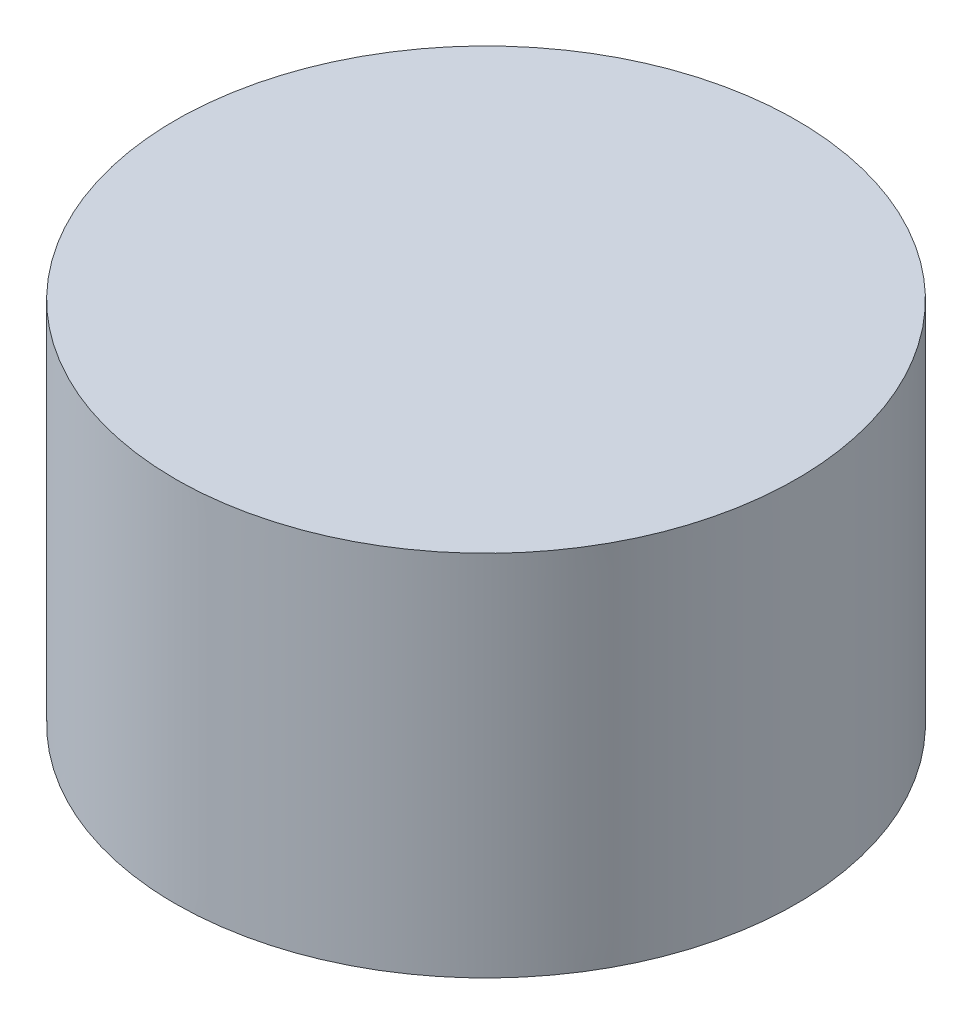
ISO-10303-21;
HEADER;
FILE_DESCRIPTION(('STEP AP214'),'2;1');
FILE_NAME('part.step','',(''),(''),'','','');
FILE_SCHEMA(('AUTOMOTIVE_DESIGN { 1 0 10303 214 1 1 1 1 }'));
ENDSEC;
DATA;
#1=APPLICATION_CONTEXT('core data for automotive mechanical design processes');
#2=APPLICATION_PROTOCOL_DEFINITION('international standard','automotive_design',2000,#1);
#3=PRODUCT_CONTEXT('',#1,'mechanical');
#4=PRODUCT('Part','Part','',(#3));
#5=PRODUCT_RELATED_PRODUCT_CATEGORY('part','',(#4));
#6=PRODUCT_DEFINITION_FORMATION('','',#4);
#7=PRODUCT_DEFINITION_CONTEXT('part definition',#1,'design');
#8=PRODUCT_DEFINITION('design','',#6,#7);
#9=PRODUCT_DEFINITION_SHAPE('','',#8);
#10=(LENGTH_UNIT() NAMED_UNIT(*) SI_UNIT(.MILLI.,.METRE.));
#11=(NAMED_UNIT(*) PLANE_ANGLE_UNIT() SI_UNIT($,.RADIAN.));
#12=(NAMED_UNIT(*) SI_UNIT($,.STERADIAN.) SOLID_ANGLE_UNIT());
#13=UNCERTAINTY_MEASURE_WITH_UNIT(LENGTH_MEASURE(1.E-05),#10,'distance_accuracy_value','');
#14=(GEOMETRIC_REPRESENTATION_CONTEXT(3) GLOBAL_UNCERTAINTY_ASSIGNED_CONTEXT((#13)) GLOBAL_UNIT_ASSIGNED_CONTEXT((#10,
#11,#12)) REPRESENTATION_CONTEXT('',''));
#15=CARTESIAN_POINT('',(0.,0.,0.));
#16=DIRECTION('',(0.,0.,1.));
#17=DIRECTION('',(1.,0.,0.));
#18=AXIS2_PLACEMENT_3D('',#15,#16,#17);
#19=CARTESIAN_POINT('',(102.999999999999,160.051383931985,163.145254833995));
#20=CARTESIAN_POINT('',(103.215334373385,160.051383931985,163.145254833995));
#21=CARTESIAN_POINT('',(103.646003120156,160.051383931985,163.059589494018));
#22=CARTESIAN_POINT('',(104.193658121302,160.051383931985,162.693658121303));
#23=CARTESIAN_POINT('',(104.559589494017,160.051383931985,162.146003120157));
#24=CARTESIAN_POINT('',(104.688087503982,160.051383931985,161.5));
#25=CARTESIAN_POINT('',(104.559589494017,160.051383931985,160.853996879843));
#26=CARTESIAN_POINT('',(104.193658121302,160.051383931985,160.306341878697));
#27=CARTESIAN_POINT('',(103.646003120156,160.051383931985,159.940410505982));
#28=CARTESIAN_POINT('',(102.999999999999,160.051383931985,159.811912496017));
#29=CARTESIAN_POINT('',(102.353996879842,160.051383931985,159.940410505982));
#30=CARTESIAN_POINT('',(101.806341878696,160.051383931985,160.306341878697));
#31=CARTESIAN_POINT('',(101.440410505981,160.051383931985,160.853996879843));
#32=CARTESIAN_POINT('',(101.311912496016,160.051383931985,161.5));
#33=CARTESIAN_POINT('',(101.440410505981,160.051383931985,162.146003120157));
#34=CARTESIAN_POINT('',(101.806341878696,160.051383931985,162.693658121303));
#35=CARTESIAN_POINT('',(102.353996879842,160.051383931985,163.059589494018));
#36=CARTESIAN_POINT('',(102.784665626614,160.051383931985,163.145254833995));
#37=CARTESIAN_POINT('',(102.999999999999,160.051383931985,163.145254833995));
#38=B_SPLINE_CURVE_WITH_KNOTS('',3,(#19,#20,#21,#22,#23,#24,#25,#26,#27,#28,#29,#30,#31,#32,#33,
#34,#35,#36,#37),.UNSPECIFIED.,.T.,.F.,(4,1,1,1,1,1,1,1,1,1,1,1,1,1,1,1,4),(0.,
0.0624999999999997,0.125000000000001,0.1875,0.25,0.3125,0.374999999999999,0.4375,0.5,0.5625,
0.625000000000001,0.6875,0.75,0.8125,0.874999999999999,0.9375,1.),.UNSPECIFIED.);
#39=DIRECTION('',(0.,1.,0.));
#40=VECTOR('',#39,1.);
#41=SURFACE_OF_LINEAR_EXTRUSION('',#38,#40);
#42=CARTESIAN_POINT('',(102.999999999999,160.051383931985,163.145254833995));
#43=CARTESIAN_POINT('',(103.215334373385,160.051383931985,163.145254833995));
#44=CARTESIAN_POINT('',(103.646003120156,160.051383931985,163.059589494018));
#45=CARTESIAN_POINT('',(104.193658121302,160.051383931985,162.693658121303));
#46=CARTESIAN_POINT('',(104.559589494017,160.051383931985,162.146003120157));
#47=CARTESIAN_POINT('',(104.688087503982,160.051383931985,161.5));
#48=CARTESIAN_POINT('',(104.559589494017,160.051383931985,160.853996879843));
#49=CARTESIAN_POINT('',(104.193658121302,160.051383931985,160.306341878697));
#50=CARTESIAN_POINT('',(103.646003120156,160.051383931985,159.940410505982));
#51=CARTESIAN_POINT('',(102.999999999999,160.051383931985,159.811912496017));
#52=CARTESIAN_POINT('',(102.353996879842,160.051383931985,159.940410505982));
#53=CARTESIAN_POINT('',(101.806341878696,160.051383931985,160.306341878697));
#54=CARTESIAN_POINT('',(101.440410505981,160.051383931985,160.853996879843));
#55=CARTESIAN_POINT('',(101.311912496016,160.051383931985,161.5));
#56=CARTESIAN_POINT('',(101.440410505981,160.051383931985,162.146003120157));
#57=CARTESIAN_POINT('',(101.806341878696,160.051383931985,162.693658121303));
#58=CARTESIAN_POINT('',(102.353996879842,160.051383931985,163.059589494018));
#59=CARTESIAN_POINT('',(102.784665626614,160.051383931985,163.145254833995));
#60=CARTESIAN_POINT('',(102.999999999999,160.051383931985,163.145254833995));
#61=B_SPLINE_CURVE_WITH_KNOTS('',3,(#42,#43,#44,#45,#46,#47,#48,#49,#50,#51,#52,#53,#54,#55,#56,
#57,#58,#59,#60),.UNSPECIFIED.,.T.,.F.,(4,1,1,1,1,1,1,1,1,1,1,1,1,1,1,1,4),(0.,
0.0624999999999997,0.125000000000001,0.1875,0.25,0.3125,0.374999999999999,0.4375,0.5,0.5625,
0.625000000000001,0.6875,0.75,0.8125,0.874999999999999,0.9375,1.),.UNSPECIFIED.);
#62=CARTESIAN_POINT('',(102.999999999999,160.051383931985,163.145254833995));
#63=VERTEX_POINT('',#62);
#64=EDGE_CURVE('E9',#63,#63,#61,.T.);
#65=ORIENTED_EDGE('',*,*,#64,.T.);
#66=EDGE_LOOP('',(#65));
#67=FACE_BOUND('',#66,.T.);
#68=CARTESIAN_POINT('',(102.999999999999,161.999,163.145254833995));
#69=CARTESIAN_POINT('',(102.973082568205,161.999,163.145254853482));
#70=CARTESIAN_POINT('',(102.946165695115,161.999,163.144585544274));
#71=CARTESIAN_POINT('',(102.892395971901,161.999,163.141921218636));
#72=CARTESIAN_POINT('',(102.865543125638,161.999,163.139926124213));
#73=CARTESIAN_POINT('',(102.811965705625,161.999,163.1346229994));
#74=CARTESIAN_POINT('',(102.785241140807,161.999,163.131314878913));
#75=CARTESIAN_POINT('',(102.73198414605,161.999,163.12339842788));
#76=CARTESIAN_POINT('',(102.705451724449,161.999,163.118790041258));
#77=CARTESIAN_POINT('',(102.652642993684,161.999,163.108285732465));
#78=CARTESIAN_POINT('',(102.62636668452,161.999,163.102389810295));
#79=CARTESIAN_POINT('',(102.574134132157,161.999,163.089323082326));
#80=CARTESIAN_POINT('',(102.548177875202,161.999,163.082152331527));
#81=CARTESIAN_POINT('',(102.496649416932,161.999,163.066548609341));
#82=CARTESIAN_POINT('',(102.471077189383,161.999,163.058115724608));
#83=CARTESIAN_POINT('',(102.420380693703,161.999,163.040000382488));
#84=CARTESIAN_POINT('',(102.395256399306,161.999,163.03031799864));
#85=CARTESIAN_POINT('',(102.345520066715,161.999,163.009716535146));
#86=CARTESIAN_POINT('',(102.32090802852,161.999,162.9987974555));
#87=CARTESIAN_POINT('',(102.272250711347,161.999,162.975759100831));
#88=CARTESIAN_POINT('',(102.248205465798,161.999,162.963639755234));
#89=CARTESIAN_POINT('',(102.200735845919,161.999,162.938237130916));
#90=CARTESIAN_POINT('',(102.177311514313,161.999,162.924953772371));
#91=CARTESIAN_POINT('',(102.131137949792,161.999,162.897259351682));
#92=CARTESIAN_POINT('',(102.10838874604,161.999,162.882848240923));
#93=CARTESIAN_POINT('',(102.063619668642,161.999,162.852934499766));
#94=CARTESIAN_POINT('',(102.041599794995,161.999,162.837431869368));
#95=CARTESIAN_POINT('',(101.998343628401,161.999,162.80537125413));
#96=CARTESIAN_POINT('',(101.977107301697,161.999,162.788813314838));
#97=CARTESIAN_POINT('',(101.93547249995,161.999,162.754678268082));
#98=CARTESIAN_POINT('',(101.915073967508,161.999,162.737101230638));
#99=CARTESIAN_POINT('',(101.875168954019,161.999,162.700964127831));
#100=CARTESIAN_POINT('',(101.855662420564,161.999,162.68240412036));
#101=CARTESIAN_POINT('',(101.817595879639,161.999,162.644337579435));
#102=CARTESIAN_POINT('',(101.799035872168,161.999,162.62483104598));
#103=CARTESIAN_POINT('',(101.762898769362,161.999,162.584926032491));
#104=CARTESIAN_POINT('',(101.745321731917,161.999,162.564527500049));
#105=CARTESIAN_POINT('',(101.711186685161,161.999,162.522892698302));
#106=CARTESIAN_POINT('',(101.694628745869,161.999,162.501656371598));
#107=CARTESIAN_POINT('',(101.662568130631,161.999,162.458400205004));
#108=CARTESIAN_POINT('',(101.647065500234,161.999,162.436380331357));
#109=CARTESIAN_POINT('',(101.617151759076,161.999,162.391611253959));
#110=CARTESIAN_POINT('',(101.602740648317,161.999,162.368862050207));
#111=CARTESIAN_POINT('',(101.575046227628,161.999,162.322688485686));
#112=CARTESIAN_POINT('',(101.561762869083,161.999,162.299264154079));
#113=CARTESIAN_POINT('',(101.536360244765,161.999,162.251794534202));
#114=CARTESIAN_POINT('',(101.524240899168,161.999,162.227749288655));
#115=CARTESIAN_POINT('',(101.501202544499,161.999,162.179091971477));
#116=CARTESIAN_POINT('',(101.490283464854,161.999,162.154479933276));
#117=CARTESIAN_POINT('',(101.469682001359,161.999,162.104743600701));
#118=CARTESIAN_POINT('',(101.45999961751,161.999,162.079619306328));
#119=CARTESIAN_POINT('',(101.441884275393,161.999,162.028922810584));
#120=CARTESIAN_POINT('',(101.433451390666,161.999,162.003350582947));
#121=CARTESIAN_POINT('',(101.417847668465,161.999,161.951822124916));
#122=CARTESIAN_POINT('',(101.410676917646,161.999,161.925865868288));
#123=CARTESIAN_POINT('',(101.397610189731,161.999,161.873633315034));
#124=CARTESIAN_POINT('',(101.391714267634,161.999,161.847357004652));
#125=CARTESIAN_POINT('',(101.381209958641,161.999,161.794548277213));
#126=CARTESIAN_POINT('',(101.376601571745,161.999,161.768015860156));
#127=CARTESIAN_POINT('',(101.368685121462,161.999,161.714758852986));
#128=CARTESIAN_POINT('',(101.365377001999,161.999,161.68803427121));
#129=CARTESIAN_POINT('',(101.360073874387,161.999,161.634456897524));
#130=CARTESIAN_POINT('',(101.358078776141,161.999,161.607604114538));
#131=CARTESIAN_POINT('',(101.355414460947,161.999,161.553834218449));
#132=CARTESIAN_POINT('',(101.354745166004,161.999,161.526917109225));
#133=CARTESIAN_POINT('',(101.354745166004,161.999,161.473082890775));
#134=CARTESIAN_POINT('',(101.355414460947,161.999,161.446165781551));
#135=CARTESIAN_POINT('',(101.358078776141,161.999,161.392395885462));
#136=CARTESIAN_POINT('',(101.360073874387,161.999,161.365543102476));
#137=CARTESIAN_POINT('',(101.365377001998,161.999,161.31196572879));
#138=CARTESIAN_POINT('',(101.368685121462,161.999,161.285241147014));
#139=CARTESIAN_POINT('',(101.376601571745,161.999,161.231984139844));
#140=CARTESIAN_POINT('',(101.381209958641,161.999,161.205451722787));
#141=CARTESIAN_POINT('',(101.391714267634,161.999,161.152642995348));
#142=CARTESIAN_POINT('',(101.397610189731,161.999,161.126366684966));
#143=CARTESIAN_POINT('',(101.410676917646,161.999,161.074134131712));
#144=CARTESIAN_POINT('',(101.417847668465,161.999,161.048177875084));
#145=CARTESIAN_POINT('',(101.433451390666,161.999,160.996649417053));
#146=CARTESIAN_POINT('',(101.441884275393,161.999,160.971077189416));
#147=CARTESIAN_POINT('',(101.45999961751,161.999,160.920380693672));
#148=CARTESIAN_POINT('',(101.469682001359,161.999,160.895256399299));
#149=CARTESIAN_POINT('',(101.490283464854,161.999,160.845520066724));
#150=CARTESIAN_POINT('',(101.501202544499,161.999,160.820908028523));
#151=CARTESIAN_POINT('',(101.524240899168,161.999,160.772250711345));
#152=CARTESIAN_POINT('',(101.536360244765,161.999,160.748205465798));
#153=CARTESIAN_POINT('',(101.561762869083,161.999,160.700735845921));
#154=CARTESIAN_POINT('',(101.575046227628,161.999,160.677311514314));
#155=CARTESIAN_POINT('',(101.602740648317,161.999,160.631137949793));
#156=CARTESIAN_POINT('',(101.617151759076,161.999,160.608388746041));
#157=CARTESIAN_POINT('',(101.647065500233,161.999,160.563619668643));
#158=CARTESIAN_POINT('',(101.662568130631,161.999,160.541599794996));
#159=CARTESIAN_POINT('',(101.694628745869,161.999,160.498343628402));
#160=CARTESIAN_POINT('',(101.711186685161,161.999,160.477107301698));
#161=CARTESIAN_POINT('',(101.745321731917,161.999,160.435472499951));
#162=CARTESIAN_POINT('',(101.762898769362,161.999,160.415073967509));
#163=CARTESIAN_POINT('',(101.799035872168,161.999,160.37516895402));
#164=CARTESIAN_POINT('',(101.817595879639,161.999,160.355662420565));
#165=CARTESIAN_POINT('',(101.855662420564,161.999,160.31759587964));
#166=CARTESIAN_POINT('',(101.875168954019,161.999,160.299035872169));
#167=CARTESIAN_POINT('',(101.915073967508,161.999,160.262898769362));
#168=CARTESIAN_POINT('',(101.93547249995,161.999,160.245321731918));
#169=CARTESIAN_POINT('',(101.977107301697,161.999,160.211186685162));
#170=CARTESIAN_POINT('',(101.998343628401,161.999,160.19462874587));
#171=CARTESIAN_POINT('',(102.041599794995,161.999,160.162568130632));
#172=CARTESIAN_POINT('',(102.063619668642,161.999,160.147065500234));
#173=CARTESIAN_POINT('',(102.10838874604,161.999,160.117151759077));
#174=CARTESIAN_POINT('',(102.131137949792,161.999,160.102740648318));
#175=CARTESIAN_POINT('',(102.177311514313,161.999,160.075046227629));
#176=CARTESIAN_POINT('',(102.20073584592,161.999,160.061762869084));
#177=CARTESIAN_POINT('',(102.248205465797,161.999,160.036360244766));
#178=CARTESIAN_POINT('',(102.272250711345,161.999,160.024240899169));
#179=CARTESIAN_POINT('',(102.320908028522,161.999,160.0012025445));
#180=CARTESIAN_POINT('',(102.345520066724,161.999,159.990283464854));
#181=CARTESIAN_POINT('',(102.395256399298,161.999,159.969682001359));
#182=CARTESIAN_POINT('',(102.420380693671,161.999,159.95999961751));
#183=CARTESIAN_POINT('',(102.471077189415,161.999,159.941884275394));
#184=CARTESIAN_POINT('',(102.496649417052,161.999,159.933451390666));
#185=CARTESIAN_POINT('',(102.548177875083,161.999,159.917847668466));
#186=CARTESIAN_POINT('',(102.574134131711,161.999,159.910676917647));
#187=CARTESIAN_POINT('',(102.626366684965,161.999,159.897610189732));
#188=CARTESIAN_POINT('',(102.652642995347,161.999,159.891714267635));
#189=CARTESIAN_POINT('',(102.705451722786,161.999,159.881209958642));
#190=CARTESIAN_POINT('',(102.731984139843,161.999,159.876601571745));
#191=CARTESIAN_POINT('',(102.785241147013,161.999,159.868685121462));
#192=CARTESIAN_POINT('',(102.811965728789,161.999,159.865377001999));
#193=CARTESIAN_POINT('',(102.865543102475,161.999,159.860073874387));
#194=CARTESIAN_POINT('',(102.892395885461,161.999,159.858078776142));
#195=CARTESIAN_POINT('',(102.94616578155,161.999,159.855414460947));
#196=CARTESIAN_POINT('',(102.973082890774,161.999,159.854745166005));
#197=CARTESIAN_POINT('',(103.026917109224,161.999,159.854745166005));
#198=CARTESIAN_POINT('',(103.053834218449,161.999,159.855414460947));
#199=CARTESIAN_POINT('',(103.107604114537,161.999,159.858078776142));
#200=CARTESIAN_POINT('',(103.134456897523,161.999,159.860073874387));
#201=CARTESIAN_POINT('',(103.188034271209,161.999,159.865377001999));
#202=CARTESIAN_POINT('',(103.214758852985,161.999,159.868685121462));
#203=CARTESIAN_POINT('',(103.268015860155,161.999,159.876601571745));
#204=CARTESIAN_POINT('',(103.294548277212,161.999,159.881209958642));
#205=CARTESIAN_POINT('',(103.347357004651,161.999,159.891714267635));
#206=CARTESIAN_POINT('',(103.373633315033,161.999,159.897610189732));
#207=CARTESIAN_POINT('',(103.425865868287,161.999,159.910676917647));
#208=CARTESIAN_POINT('',(103.451822124915,161.999,159.917847668466));
#209=CARTESIAN_POINT('',(103.503350582947,161.999,159.933451390667));
#210=CARTESIAN_POINT('',(103.528922810583,161.999,159.941884275394));
#211=CARTESIAN_POINT('',(103.579619306328,161.999,159.95999961751));
#212=CARTESIAN_POINT('',(103.6047436007,161.999,159.969682001359));
#213=CARTESIAN_POINT('',(103.654479933275,161.999,159.990283464854));
#214=CARTESIAN_POINT('',(103.679091971476,161.999,160.0012025445));
#215=CARTESIAN_POINT('',(103.727749288654,161.999,160.024240899169));
#216=CARTESIAN_POINT('',(103.751794534201,161.999,160.036360244766));
#217=CARTESIAN_POINT('',(103.799264154078,161.999,160.061762869084));
#218=CARTESIAN_POINT('',(103.822688485685,161.999,160.075046227629));
#219=CARTESIAN_POINT('',(103.868862050206,161.999,160.102740648318));
#220=CARTESIAN_POINT('',(103.891611253958,161.999,160.117151759077));
#221=CARTESIAN_POINT('',(103.936380331357,161.999,160.147065500234));
#222=CARTESIAN_POINT('',(103.958400205003,161.999,160.162568130632));
#223=CARTESIAN_POINT('',(104.001656371598,161.999,160.19462874587));
#224=CARTESIAN_POINT('',(104.022892698301,161.999,160.211186685162));
#225=CARTESIAN_POINT('',(104.064527500048,161.999,160.245321731918));
#226=CARTESIAN_POINT('',(104.08492603249,161.999,160.262898769362));
#227=CARTESIAN_POINT('',(104.124831045979,161.999,160.299035872169));
#228=CARTESIAN_POINT('',(104.144337579434,161.999,160.31759587964));
#229=CARTESIAN_POINT('',(104.18240412036,161.999,160.355662420565));
#230=CARTESIAN_POINT('',(104.20096412783,161.999,160.37516895402));
#231=CARTESIAN_POINT('',(104.237101230637,161.999,160.415073967509));
#232=CARTESIAN_POINT('',(104.254678268081,161.999,160.435472499951));
#233=CARTESIAN_POINT('',(104.288813314837,161.999,160.477107301698));
#234=CARTESIAN_POINT('',(104.30537125413,161.999,160.498343628402));
#235=CARTESIAN_POINT('',(104.337431869367,161.999,160.541599794996));
#236=CARTESIAN_POINT('',(104.352934499765,161.999,160.563619668643));
#237=CARTESIAN_POINT('',(104.382848240922,161.999,160.608388746041));
#238=CARTESIAN_POINT('',(104.397259351682,161.999,160.631137949793));
#239=CARTESIAN_POINT('',(104.42495377237,161.999,160.677311514314));
#240=CARTESIAN_POINT('',(104.438237130915,161.999,160.700735845921));
#241=CARTESIAN_POINT('',(104.463639755234,161.999,160.748205465798));
#242=CARTESIAN_POINT('',(104.47575910083,161.999,160.772250711345));
#243=CARTESIAN_POINT('',(104.498797455499,161.999,160.820908028523));
#244=CARTESIAN_POINT('',(104.509716535145,161.999,160.845520066725));
#245=CARTESIAN_POINT('',(104.53031799864,161.999,160.895256399299));
#246=CARTESIAN_POINT('',(104.540000382489,161.999,160.920380693672));
#247=CARTESIAN_POINT('',(104.558115724606,161.999,160.971077189416));
#248=CARTESIAN_POINT('',(104.566548609333,161.999,160.996649417053));
#249=CARTESIAN_POINT('',(104.582152331533,161.999,161.048177875084));
#250=CARTESIAN_POINT('',(104.589323082352,161.999,161.074134131712));
#251=CARTESIAN_POINT('',(104.602389810267,161.999,161.126366684966));
#252=CARTESIAN_POINT('',(104.608285732364,161.999,161.152642995348));
#253=CARTESIAN_POINT('',(104.618790041357,161.999,161.205451722787));
#254=CARTESIAN_POINT('',(104.623398428254,161.999,161.231984139844));
#255=CARTESIAN_POINT('',(104.631314878537,161.999,161.285241147014));
#256=CARTESIAN_POINT('',(104.634622998,161.999,161.31196572879));
#257=CARTESIAN_POINT('',(104.639926125612,161.999,161.365543102476));
#258=CARTESIAN_POINT('',(104.641921223857,161.999,161.392395885462));
#259=CARTESIAN_POINT('',(104.644585539052,161.999,161.446165781551));
#260=CARTESIAN_POINT('',(104.645254833994,161.999,161.473082890775));
#261=CARTESIAN_POINT('',(104.645254833994,161.999,161.526917109225));
#262=CARTESIAN_POINT('',(104.644585539052,161.999,161.553834218449));
#263=CARTESIAN_POINT('',(104.641921223857,161.999,161.607604114538));
#264=CARTESIAN_POINT('',(104.639926125612,161.999,161.634456897524));
#265=CARTESIAN_POINT('',(104.634622998,161.999,161.68803427121));
#266=CARTESIAN_POINT('',(104.631314878537,161.999,161.714758852986));
#267=CARTESIAN_POINT('',(104.623398428254,161.999,161.768015860156));
#268=CARTESIAN_POINT('',(104.618790041357,161.999,161.794548277213));
#269=CARTESIAN_POINT('',(104.608285732364,161.999,161.847357004652));
#270=CARTESIAN_POINT('',(104.602389810267,161.999,161.873633315034));
#271=CARTESIAN_POINT('',(104.589323082353,161.999,161.925865868288));
#272=CARTESIAN_POINT('',(104.582152331533,161.999,161.951822124916));
#273=CARTESIAN_POINT('',(104.566548609333,161.999,162.003350582947));
#274=CARTESIAN_POINT('',(104.558115724606,161.999,162.028922810584));
#275=CARTESIAN_POINT('',(104.540000382489,161.999,162.079619306328));
#276=CARTESIAN_POINT('',(104.53031799864,161.999,162.104743600701));
#277=CARTESIAN_POINT('',(104.509716535145,161.999,162.154479933275));
#278=CARTESIAN_POINT('',(104.498797455499,161.999,162.179091971477));
#279=CARTESIAN_POINT('',(104.47575910083,161.999,162.227749288655));
#280=CARTESIAN_POINT('',(104.463639755234,161.999,162.251794534202));
#281=CARTESIAN_POINT('',(104.438237130915,161.999,162.299264154079));
#282=CARTESIAN_POINT('',(104.42495377237,161.999,162.322688485686));
#283=CARTESIAN_POINT('',(104.397259351682,161.999,162.368862050207));
#284=CARTESIAN_POINT('',(104.382848240922,161.999,162.391611253959));
#285=CARTESIAN_POINT('',(104.352934499765,161.999,162.436380331357));
#286=CARTESIAN_POINT('',(104.337431869368,161.999,162.458400205004));
#287=CARTESIAN_POINT('',(104.30537125413,161.999,162.501656371598));
#288=CARTESIAN_POINT('',(104.288813314837,161.999,162.522892698302));
#289=CARTESIAN_POINT('',(104.254678268081,161.999,162.564527500049));
#290=CARTESIAN_POINT('',(104.237101230637,161.999,162.584926032491));
#291=CARTESIAN_POINT('',(104.20096412783,161.999,162.62483104598));
#292=CARTESIAN_POINT('',(104.18240412036,161.999,162.644337579435));
#293=CARTESIAN_POINT('',(104.144337579434,161.999,162.68240412036));
#294=CARTESIAN_POINT('',(104.124831045979,161.999,162.700964127831));
#295=CARTESIAN_POINT('',(104.08492603249,161.999,162.737101230638));
#296=CARTESIAN_POINT('',(104.064527500048,161.999,162.754678268082));
#297=CARTESIAN_POINT('',(104.022892698301,161.999,162.788813314838));
#298=CARTESIAN_POINT('',(104.001656371598,161.999,162.80537125413));
#299=CARTESIAN_POINT('',(103.958400205003,161.999,162.837431869368));
#300=CARTESIAN_POINT('',(103.936380331357,161.999,162.852934499766));
#301=CARTESIAN_POINT('',(103.891611253958,161.999,162.882848240923));
#302=CARTESIAN_POINT('',(103.868862050206,161.999,162.897259351682));
#303=CARTESIAN_POINT('',(103.822688485685,161.999,162.924953772371));
#304=CARTESIAN_POINT('',(103.799264154079,161.999,162.938237130916));
#305=CARTESIAN_POINT('',(103.7517945342,161.999,162.963639755234));
#306=CARTESIAN_POINT('',(103.727749288651,161.999,162.975759100831));
#307=CARTESIAN_POINT('',(103.679091971478,161.999,162.9987974555));
#308=CARTESIAN_POINT('',(103.654479933283,161.999,163.009716535146));
#309=CARTESIAN_POINT('',(103.604743600692,161.999,163.03031799864));
#310=CARTESIAN_POINT('',(103.579619306296,161.999,163.040000382488));
#311=CARTESIAN_POINT('',(103.528922810615,161.999,163.058115724608));
#312=CARTESIAN_POINT('',(103.503350583066,161.999,163.066548609341));
#313=CARTESIAN_POINT('',(103.451822124796,161.999,163.082152331527));
#314=CARTESIAN_POINT('',(103.425865867841,161.999,163.089323082326));
#315=CARTESIAN_POINT('',(103.373633315479,161.999,163.102389810295));
#316=CARTESIAN_POINT('',(103.347357006314,161.999,163.108285732465));
#317=CARTESIAN_POINT('',(103.294548275549,161.999,163.118790041258));
#318=CARTESIAN_POINT('',(103.268015853948,161.999,163.123398427879));
#319=CARTESIAN_POINT('',(103.214758859192,161.999,163.131314878912));
#320=CARTESIAN_POINT('',(103.188034294373,161.999,163.1346229994));
#321=CARTESIAN_POINT('',(103.134456874361,161.999,163.139926124213));
#322=CARTESIAN_POINT('',(103.107604028097,161.999,163.141921218636));
#323=CARTESIAN_POINT('',(103.053834304883,161.999,163.144585544274));
#324=CARTESIAN_POINT('',(103.026917431793,161.999,163.145254853482));
#325=CARTESIAN_POINT('',(102.999999999999,161.999,163.145254833995));
#326=B_SPLINE_CURVE_WITH_KNOTS('',3,(#68,#69,#70,#71,#72,#73,#74,#75,#76,#77,#78,#79,#80,#81,
#82,#83,#84,#85,#86,#87,#88,#89,#90,#91,#92,#93,#94,#95,#96,#97,#98,#99,#100,#101,#102,#103,
#104,#105,#106,#107,#108,#109,#110,#111,#112,#113,#114,#115,#116,#117,#118,#119,#120,#121,#122,
#123,#124,#125,#126,#127,#128,#129,#130,#131,#132,#133,#134,#135,#136,#137,#138,#139,#140,#141,
#142,#143,#144,#145,#146,#147,#148,#149,#150,#151,#152,#153,#154,#155,#156,#157,#158,#159,#160,
#161,#162,#163,#164,#165,#166,#167,#168,#169,#170,#171,#172,#173,#174,#175,#176,#177,#178,#179,
#180,#181,#182,#183,#184,#185,#186,#187,#188,#189,#190,#191,#192,#193,#194,#195,#196,#197,#198,
#199,#200,#201,#202,#203,#204,#205,#206,#207,#208,#209,#210,#211,#212,#213,#214,#215,#216,#217,
#218,#219,#220,#221,#222,#223,#224,#225,#226,#227,#228,#229,#230,#231,#232,#233,#234,#235,#236,
#237,#238,#239,#240,#241,#242,#243,#244,#245,#246,#247,#248,#249,#250,#251,#252,#253,#254,#255,
#256,#257,#258,#259,#260,#261,#262,#263,#264,#265,#266,#267,#268,#269,#270,#271,#272,#273,#274,
#275,#276,#277,#278,#279,#280,#281,#282,#283,#284,#285,#286,#287,#288,#289,#290,#291,#292,#293,
#294,#295,#296,#297,#298,#299,#300,#301,#302,#303,#304,#305,#306,#307,#308,#309,#310,#311,#312,
#313,#314,#315,#316,#317,#318,#319,#320,#321,#322,#323,#324,#325),.UNSPECIFIED.,.F.,.F.,(4,2,2,
2,2,2,2,2,2,2,2,2,2,2,2,2,2,2,2,2,2,2,2,2,2,2,2,2,2,2,2,2,2,2,2,2,2,2,2,2,2,2,2,2,2,2,2,2,2,2,2,
2,2,2,2,2,2,2,2,2,2,2,2,2,2,2,2,2,2,2,2,2,2,2,2,2,2,2,2,2,2,2,2,2,2,2,2,2,2,2,2,2,2,2,2,2,2,2,2,
2,2,2,2,2,2,2,2,2,2,2,2,2,2,2,2,2,2,2,2,2,2,2,2,2,2,2,2,2,4),(0.,0.080743184382781,
0.161491119116153,0.242244595572099,0.323001555201875,0.403758514831639,0.484511991287583,
0.565259926020989,0.646003110403743,0.726746294786516,0.807494229519937,0.888247705975865,
0.969004665605673,1.04976162523546,1.13051510169141,1.21126303642485,1.29200622080761,
1.37274940519039,1.45349733992377,1.53425081637969,1.61500777600949,1.69576473563926,
1.77651821209521,1.85726614682861,1.93800933121138,2.01875251559412,2.09950045032754,
2.18025392678352,2.26101088641328,2.34176784604304,2.422521322499,2.50326925723243,
2.5840124416152,2.66475562599796,2.74550356073134,2.82625703718733,2.90701399681711,
2.98777095644688,3.06852443290285,3.14927236763627,3.23001555201902,3.31075873640179,
3.39150667113519,3.47226014759114,3.55301710722091,3.6337740668507,3.71452754330665,
3.79527547804004,3.87601866242281,3.9567618468056,4.03750978153899,4.11826325799495,
4.19902021762471,4.27977717725447,4.36053065371045,4.44127858844384,4.52202177282662,
4.60276495720937,4.68351289194276,4.76426636839874,4.8450233280285,4.92578028765829,
5.00653376411422,5.08728169884765,5.16802488323042,5.24876806761318,5.32951600234659,
5.41026947880255,5.49102643843234,5.5717833980621,5.65253687451808,5.73328480925147,
5.81402799363424,5.89477117801701,5.97551911275039,6.05627258920638,6.13702954883614,
6.21778650846592,6.29853998492187,6.37928791965527,6.46003110403803,6.5407742884208,
6.62152222315416,6.70227569961013,6.7830326592399,6.86378961886967,6.94454309532565,
7.02529103005903,7.1060342144418,7.18677739882461,7.26752533355798,7.34827881001395,
7.42903576964371,7.50979272927347,7.59054620572946,7.67129414046284,7.75203732484563,
7.83278050922837,7.91352844396177,7.99428192041773,8.0750388800475,8.15579583967729,
8.23654931613327,8.31729725086666,8.3980404352494,8.47878361963217,8.55953155436559,
8.64028503082153,8.7210419904513,8.80179895008107,8.88255242653704,8.96330036127045,
9.0440435456532,9.12478673003598,9.20553466476938,9.28628814122534,9.36704510085512,
9.44780206048486,9.52855553694084,9.60930347167424,9.69004665605701,9.77078984043977,
9.85153777517317,9.93229125162913,10.0130482112589,10.0938051708887,10.1745586473446,
10.255306582078,10.3360497664608),.UNSPECIFIED.);
#327=CARTESIAN_POINT('',(102.999999999999,161.999,163.145254833995));
#328=VERTEX_POINT('',#327);
#329=EDGE_CURVE('E24',#328,#328,#326,.F.);
#330=ORIENTED_EDGE('',*,*,#329,.F.);
#331=EDGE_LOOP('',(#330));
#332=FACE_BOUND('',#331,.T.);
#333=ADVANCED_FACE('F14',(#67,#332),#41,.T.);
#334=CARTESIAN_POINT('',(87.9999999999996,160.051383931985,124.457721302983));
#335=DIRECTION('',(0.,1.,0.));
#336=DIRECTION('',(-1.,0.,0.));
#337=AXIS2_PLACEMENT_3D('',#334,#335,#336);
#338=PLANE('',#337);
#339=ORIENTED_EDGE('',*,*,#64,.F.);
#340=EDGE_LOOP('',(#339));
#341=FACE_BOUND('',#340,.T.);
#342=ADVANCED_FACE('F62',(#341),#338,.F.);
#343=CARTESIAN_POINT('',(87.9999999999996,161.999,124.457721302983));
#344=DIRECTION('',(0.,1.,0.));
#345=DIRECTION('',(-1.,0.,0.));
#346=AXIS2_PLACEMENT_3D('',#343,#344,#345);
#347=PLANE('',#346);
#348=ORIENTED_EDGE('',*,*,#329,.T.);
#349=EDGE_LOOP('',(#348));
#350=FACE_BOUND('',#349,.T.);
#351=ADVANCED_FACE('F31',(#350),#347,.T.);
#352=CLOSED_SHELL('',(#333,#342,#351));
#353=MANIFOLD_SOLID_BREP('B1',#352);
#354=ADVANCED_BREP_SHAPE_REPRESENTATION('',(#18,#353),#14);
#355=SHAPE_DEFINITION_REPRESENTATION(#9,#354);
ENDSEC;
END-ISO-10303-21;
